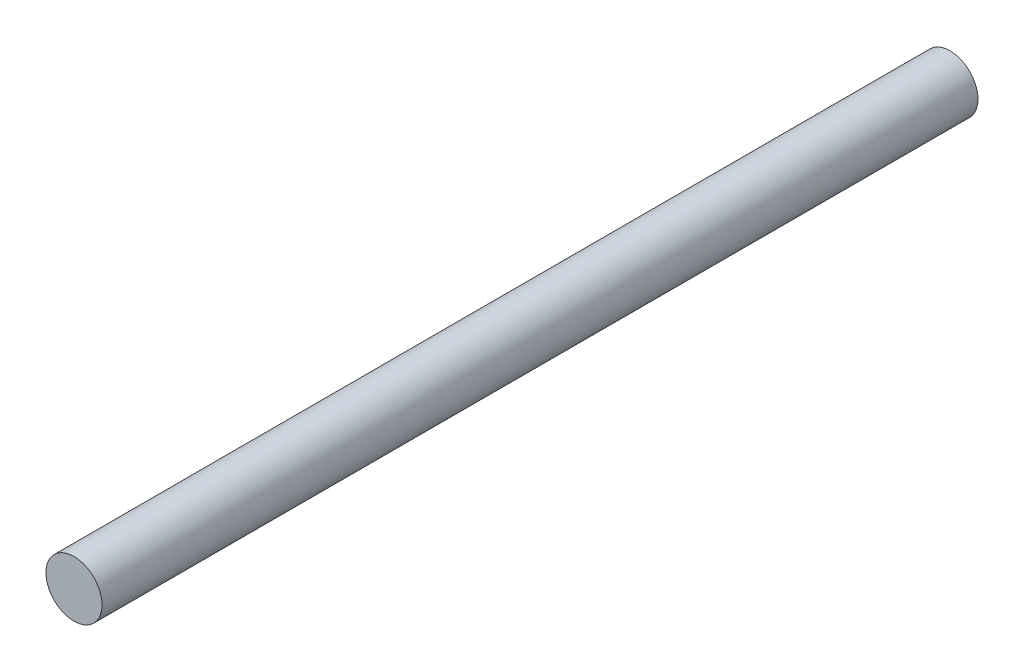
ISO-10303-21;
HEADER;
FILE_DESCRIPTION(('STEP AP214'),'2;1');
FILE_NAME('part.step','',(''),(''),'','','');
FILE_SCHEMA(('AUTOMOTIVE_DESIGN { 1 0 10303 214 1 1 1 1 }'));
ENDSEC;
DATA;
#1=APPLICATION_CONTEXT('core data for automotive mechanical design processes');
#2=APPLICATION_PROTOCOL_DEFINITION('international standard','automotive_design',2000,#1);
#3=PRODUCT_CONTEXT('',#1,'mechanical');
#4=PRODUCT('Part','Part','',(#3));
#5=PRODUCT_RELATED_PRODUCT_CATEGORY('part','',(#4));
#6=PRODUCT_DEFINITION_FORMATION('','',#4);
#7=PRODUCT_DEFINITION_CONTEXT('part definition',#1,'design');
#8=PRODUCT_DEFINITION('design','',#6,#7);
#9=PRODUCT_DEFINITION_SHAPE('','',#8);
#10=(LENGTH_UNIT() NAMED_UNIT(*) SI_UNIT(.MILLI.,.METRE.));
#11=(NAMED_UNIT(*) PLANE_ANGLE_UNIT() SI_UNIT($,.RADIAN.));
#12=(NAMED_UNIT(*) SI_UNIT($,.STERADIAN.) SOLID_ANGLE_UNIT());
#13=UNCERTAINTY_MEASURE_WITH_UNIT(LENGTH_MEASURE(1.E-05),#10,'distance_accuracy_value','');
#14=(GEOMETRIC_REPRESENTATION_CONTEXT(3) GLOBAL_UNCERTAINTY_ASSIGNED_CONTEXT((#13)) GLOBAL_UNIT_ASSIGNED_CONTEXT((#10,
#11,#12)) REPRESENTATION_CONTEXT('',''));
#15=CARTESIAN_POINT('',(0.,0.,0.));
#16=DIRECTION('',(0.,0.,1.));
#17=DIRECTION('',(1.,0.,0.));
#18=AXIS2_PLACEMENT_3D('',#15,#16,#17);
#19=CARTESIAN_POINT('',(0.,0.,250.));
#20=DIRECTION('',(0.,0.,-1.));
#21=DIRECTION('',(-1.,0.,0.));
#22=AXIS2_PLACEMENT_3D('',#19,#20,#21);
#23=CYLINDRICAL_SURFACE('',#22,8.);
#24=CARTESIAN_POINT('',(0.,0.,250.));
#25=DIRECTION('',(0.,0.,1.));
#26=DIRECTION('',(1.,0.,0.));
#27=AXIS2_PLACEMENT_3D('',#24,#25,#26);
#28=CIRCLE('',#27,8.);
#29=CARTESIAN_POINT('',(8.,0.,250.));
#30=VERTEX_POINT('',#29);
#31=EDGE_CURVE('E10',#30,#30,#28,.T.);
#32=ORIENTED_EDGE('',*,*,#31,.F.);
#33=EDGE_LOOP('',(#32));
#34=FACE_BOUND('',#33,.T.);
#35=CARTESIAN_POINT('',(0.,0.,0.));
#36=DIRECTION('',(0.,0.,1.));
#37=DIRECTION('',(1.,0.,0.));
#38=AXIS2_PLACEMENT_3D('',#35,#36,#37);
#39=CIRCLE('',#38,8.);
#40=CARTESIAN_POINT('',(8.,0.,0.));
#41=VERTEX_POINT('',#40);
#42=EDGE_CURVE('E34',#41,#41,#39,.T.);
#43=ORIENTED_EDGE('',*,*,#42,.T.);
#44=EDGE_LOOP('',(#43));
#45=FACE_BOUND('',#44,.T.);
#46=ADVANCED_FACE('F31',(#34,#45),#23,.T.);
#47=CARTESIAN_POINT('',(0.,0.,250.));
#48=DIRECTION('',(0.,0.,1.));
#49=DIRECTION('',(1.,0.,0.));
#50=AXIS2_PLACEMENT_3D('',#47,#48,#49);
#51=PLANE('',#50);
#52=ORIENTED_EDGE('',*,*,#31,.T.);
#53=EDGE_LOOP('',(#52));
#54=FACE_BOUND('',#53,.T.);
#55=ADVANCED_FACE('F46',(#54),#51,.T.);
#56=CARTESIAN_POINT('',(0.,0.,0.));
#57=DIRECTION('',(0.,0.,1.));
#58=DIRECTION('',(1.,0.,0.));
#59=AXIS2_PLACEMENT_3D('',#56,#57,#58);
#60=PLANE('',#59);
#61=ORIENTED_EDGE('',*,*,#42,.F.);
#62=EDGE_LOOP('',(#61));
#63=FACE_BOUND('',#62,.T.);
#64=ADVANCED_FACE('F44',(#63),#60,.F.);
#65=CLOSED_SHELL('',(#46,#55,#64));
#66=MANIFOLD_SOLID_BREP('B2',#65);
#67=ADVANCED_BREP_SHAPE_REPRESENTATION('',(#18,#66),#14);
#68=SHAPE_DEFINITION_REPRESENTATION(#9,#67);
ENDSEC;
END-ISO-10303-21;
